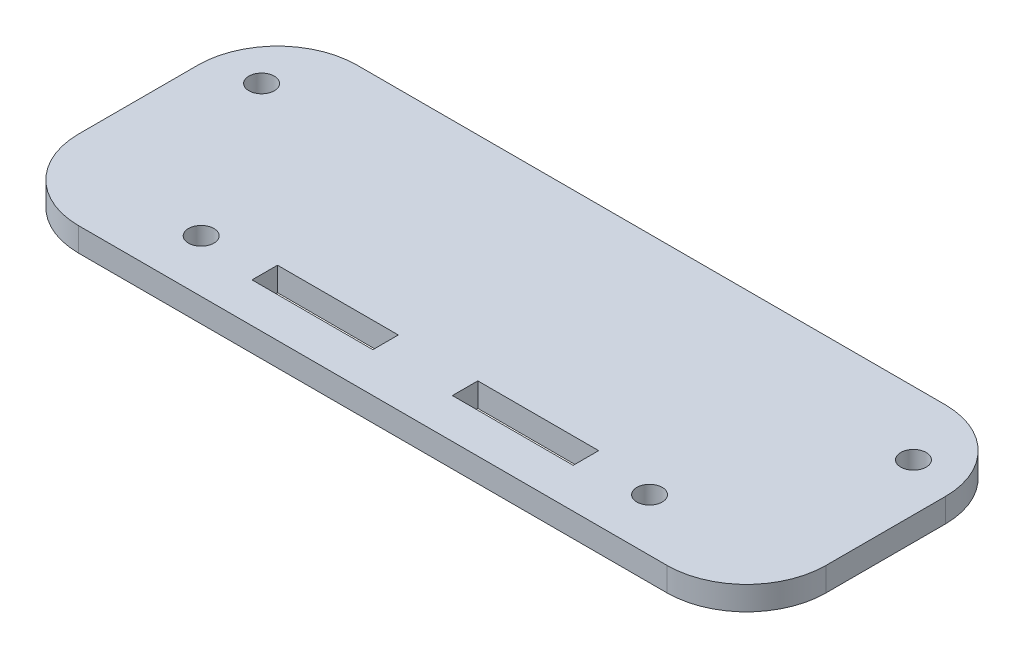
ISO-10303-21;
HEADER;
FILE_DESCRIPTION(('STEP AP214'),'2;1');
FILE_NAME('part.step','',(''),(''),'','','');
FILE_SCHEMA(('AUTOMOTIVE_DESIGN { 1 0 10303 214 1 1 1 1 }'));
ENDSEC;
DATA;
#1=APPLICATION_CONTEXT('core data for automotive mechanical design processes');
#2=APPLICATION_PROTOCOL_DEFINITION('international standard','automotive_design',2000,#1);
#3=PRODUCT_CONTEXT('',#1,'mechanical');
#4=PRODUCT('Part','Part','',(#3));
#5=PRODUCT_RELATED_PRODUCT_CATEGORY('part','',(#4));
#6=PRODUCT_DEFINITION_FORMATION('','',#4);
#7=PRODUCT_DEFINITION_CONTEXT('part definition',#1,'design');
#8=PRODUCT_DEFINITION('design','',#6,#7);
#9=PRODUCT_DEFINITION_SHAPE('','',#8);
#10=(LENGTH_UNIT() NAMED_UNIT(*) SI_UNIT(.MILLI.,.METRE.));
#11=(NAMED_UNIT(*) PLANE_ANGLE_UNIT() SI_UNIT($,.RADIAN.));
#12=(NAMED_UNIT(*) SI_UNIT($,.STERADIAN.) SOLID_ANGLE_UNIT());
#13=UNCERTAINTY_MEASURE_WITH_UNIT(LENGTH_MEASURE(1.E-05),#10,'distance_accuracy_value','');
#14=(GEOMETRIC_REPRESENTATION_CONTEXT(3) GLOBAL_UNCERTAINTY_ASSIGNED_CONTEXT((#13)) GLOBAL_UNIT_ASSIGNED_CONTEXT((#10,
#11,#12)) REPRESENTATION_CONTEXT('',''));
#15=CARTESIAN_POINT('',(0.,0.,0.));
#16=DIRECTION('',(0.,0.,1.));
#17=DIRECTION('',(1.,0.,0.));
#18=AXIS2_PLACEMENT_3D('',#15,#16,#17);
#19=CARTESIAN_POINT('',(0.,3.,0.));
#20=DIRECTION('',(0.,-1.,0.));
#21=DIRECTION('',(0.,0.,-1.));
#22=AXIS2_PLACEMENT_3D('',#19,#20,#21);
#23=PLANE('',#22);
#24=DIRECTION('',(0.,0.,1.));
#25=VECTOR('',#24,1.);
#26=CARTESIAN_POINT('',(14.8,3.,-8.2));
#27=LINE('',#26,#25);
#28=CARTESIAN_POINT('',(14.8,3.,-8.2));
#29=VERTEX_POINT('',#28);
#30=CARTESIAN_POINT('',(14.8,3.,-5.));
#31=VERTEX_POINT('',#30);
#32=EDGE_CURVE('E199',#29,#31,#27,.T.);
#33=ORIENTED_EDGE('',*,*,#32,.F.);
#34=DIRECTION('',(-1.,0.,0.));
#35=VECTOR('',#34,1.);
#36=CARTESIAN_POINT('',(14.8,3.,-8.2));
#37=LINE('',#36,#35);
#38=CARTESIAN_POINT('',(30.,3.,-8.2));
#39=VERTEX_POINT('',#38);
#40=EDGE_CURVE('E207',#39,#29,#37,.T.);
#41=ORIENTED_EDGE('',*,*,#40,.F.);
#42=DIRECTION('',(0.,0.,-1.));
#43=VECTOR('',#42,1.);
#44=CARTESIAN_POINT('',(30.,3.,-8.2));
#45=LINE('',#44,#43);
#46=CARTESIAN_POINT('',(30.,3.,-5.));
#47=VERTEX_POINT('',#46);
#48=EDGE_CURVE('E204',#47,#39,#45,.T.);
#49=ORIENTED_EDGE('',*,*,#48,.F.);
#50=DIRECTION('',(1.,0.,0.));
#51=VECTOR('',#50,1.);
#52=CARTESIAN_POINT('',(14.8,3.,-5.));
#53=LINE('',#52,#51);
#54=EDGE_CURVE('E201',#31,#47,#53,.T.);
#55=ORIENTED_EDGE('',*,*,#54,.F.);
#56=EDGE_LOOP('',(#33,#41,#49,#55));
#57=FACE_BOUND('',#56,.T.);
#58=DIRECTION('',(0.,0.,1.));
#59=VECTOR('',#58,1.);
#60=CARTESIAN_POINT('',(-12.,3.,-34.9999999999994));
#61=LINE('',#60,#59);
#62=CARTESIAN_POINT('',(-12.,3.,-24.9999999999994));
#63=VERTEX_POINT('',#62);
#64=CARTESIAN_POINT('',(-12.,3.,-10.));
#65=VERTEX_POINT('',#64);
#66=EDGE_CURVE('E284',#63,#65,#61,.T.);
#67=ORIENTED_EDGE('',*,*,#66,.T.);
#68=CARTESIAN_POINT('',(-1.99999999999999,3.,-10.));
#69=DIRECTION('',(0.,-1.,0.));
#70=DIRECTION('',(0.,0.,-1.));
#71=AXIS2_PLACEMENT_3D('',#68,#69,#70);
#72=CIRCLE('',#71,10.);
#73=CARTESIAN_POINT('',(-1.99999999999999,3.,0.));
#74=VERTEX_POINT('',#73);
#75=EDGE_CURVE('E246',#65,#74,#72,.F.);
#76=ORIENTED_EDGE('',*,*,#75,.T.);
#77=DIRECTION('',(1.,0.,0.));
#78=VECTOR('',#77,1.);
#79=CARTESIAN_POINT('',(0.,3.,0.));
#80=LINE('',#79,#78);
#81=CARTESIAN_POINT('',(72.,3.,0.));
#82=VERTEX_POINT('',#81);
#83=EDGE_CURVE('E230',#74,#82,#80,.T.);
#84=ORIENTED_EDGE('',*,*,#83,.T.);
#85=CARTESIAN_POINT('',(72.,3.,-10.));
#86=DIRECTION('',(0.,-1.,0.));
#87=DIRECTION('',(0.,0.,-1.));
#88=AXIS2_PLACEMENT_3D('',#85,#86,#87);
#89=CIRCLE('',#88,10.);
#90=CARTESIAN_POINT('',(82.,3.,-10.));
#91=VERTEX_POINT('',#90);
#92=EDGE_CURVE('E242',#82,#91,#89,.F.);
#93=ORIENTED_EDGE('',*,*,#92,.T.);
#94=DIRECTION('',(0.,0.,-1.));
#95=VECTOR('',#94,1.);
#96=CARTESIAN_POINT('',(82.,3.,-34.9999999999994));
#97=LINE('',#96,#95);
#98=CARTESIAN_POINT('',(82.,3.,-24.9999999999994));
#99=VERTEX_POINT('',#98);
#100=EDGE_CURVE('E268',#91,#99,#97,.T.);
#101=ORIENTED_EDGE('',*,*,#100,.T.);
#102=CARTESIAN_POINT('',(72.,3.,-24.9999999999994));
#103=DIRECTION('',(0.,-1.,0.));
#104=DIRECTION('',(0.,0.,-1.));
#105=AXIS2_PLACEMENT_3D('',#102,#103,#104);
#106=CIRCLE('',#105,10.);
#107=CARTESIAN_POINT('',(72.,3.,-34.9999999999994));
#108=VERTEX_POINT('',#107);
#109=EDGE_CURVE('E240',#99,#108,#106,.F.);
#110=ORIENTED_EDGE('',*,*,#109,.T.);
#111=DIRECTION('',(1.,0.,0.));
#112=VECTOR('',#111,1.);
#113=CARTESIAN_POINT('',(0.,3.,-34.9999999999994));
#114=LINE('',#113,#112);
#115=CARTESIAN_POINT('',(-2.,3.,-34.9999999999994));
#116=VERTEX_POINT('',#115);
#117=EDGE_CURVE('E279',#116,#108,#114,.T.);
#118=ORIENTED_EDGE('',*,*,#117,.F.);
#119=CARTESIAN_POINT('',(-2.,3.,-24.9999999999994));
#120=DIRECTION('',(0.,-1.,0.));
#121=DIRECTION('',(0.,0.,-1.));
#122=AXIS2_PLACEMENT_3D('',#119,#120,#121);
#123=CIRCLE('',#122,10.);
#124=EDGE_CURVE('E244',#116,#63,#123,.F.);
#125=ORIENTED_EDGE('',*,*,#124,.T.);
#126=EDGE_LOOP('',(#67,#76,#84,#93,#101,#110,#118,#125));
#127=FACE_BOUND('',#126,.T.);
#128=DIRECTION('',(0.,0.,1.));
#129=VECTOR('',#128,1.);
#130=CARTESIAN_POINT('',(40.,3.,-8.2));
#131=LINE('',#130,#129);
#132=CARTESIAN_POINT('',(40.,3.,-8.2));
#133=VERTEX_POINT('',#132);
#134=CARTESIAN_POINT('',(40.,3.,-5.));
#135=VERTEX_POINT('',#134);
#136=EDGE_CURVE('E155',#133,#135,#131,.T.);
#137=ORIENTED_EDGE('',*,*,#136,.F.);
#138=DIRECTION('',(-1.,0.,0.));
#139=VECTOR('',#138,1.);
#140=CARTESIAN_POINT('',(40.,3.,-8.2));
#141=LINE('',#140,#139);
#142=CARTESIAN_POINT('',(55.2,3.,-8.2));
#143=VERTEX_POINT('',#142);
#144=EDGE_CURVE('E181',#143,#133,#141,.T.);
#145=ORIENTED_EDGE('',*,*,#144,.F.);
#146=DIRECTION('',(0.,0.,-1.));
#147=VECTOR('',#146,1.);
#148=CARTESIAN_POINT('',(55.2,3.,-8.2));
#149=LINE('',#148,#147);
#150=CARTESIAN_POINT('',(55.2,3.,-5.));
#151=VERTEX_POINT('',#150);
#152=EDGE_CURVE('E179',#151,#143,#149,.T.);
#153=ORIENTED_EDGE('',*,*,#152,.F.);
#154=DIRECTION('',(1.,0.,0.));
#155=VECTOR('',#154,1.);
#156=CARTESIAN_POINT('',(40.,3.,-5.));
#157=LINE('',#156,#155);
#158=EDGE_CURVE('E165',#135,#151,#157,.T.);
#159=ORIENTED_EDGE('',*,*,#158,.F.);
#160=EDGE_LOOP('',(#137,#145,#153,#159));
#161=FACE_BOUND('',#160,.T.);
#162=CARTESIAN_POINT('',(6.80000000000004,3.,-6.6));
#163=DIRECTION('',(0.,1.,0.));
#164=DIRECTION('',(0.,0.,1.));
#165=AXIS2_PLACEMENT_3D('',#162,#163,#164);
#166=CIRCLE('',#165,1.6);
#167=CARTESIAN_POINT('',(6.80000000000004,3.,-5.));
#168=VERTEX_POINT('',#167);
#169=EDGE_CURVE('E188',#168,#168,#166,.T.);
#170=ORIENTED_EDGE('',*,*,#169,.F.);
#171=EDGE_LOOP('',(#170));
#172=FACE_BOUND('',#171,.T.);
#173=CARTESIAN_POINT('',(63.2,3.,-6.6));
#174=DIRECTION('',(0.,1.,0.));
#175=DIRECTION('',(0.,0.,1.));
#176=AXIS2_PLACEMENT_3D('',#173,#174,#175);
#177=CIRCLE('',#176,1.60000000000001);
#178=CARTESIAN_POINT('',(63.2,3.,-4.99999999999999));
#179=VERTEX_POINT('',#178);
#180=EDGE_CURVE('E293',#179,#179,#177,.T.);
#181=ORIENTED_EDGE('',*,*,#180,.F.);
#182=EDGE_LOOP('',(#181));
#183=FACE_BOUND('',#182,.T.);
#184=CARTESIAN_POINT('',(76.,3.,-26.9999999999994));
#185=DIRECTION('',(0.,1.,0.));
#186=DIRECTION('',(0.,0.,1.));
#187=AXIS2_PLACEMENT_3D('',#184,#185,#186);
#188=CIRCLE('',#187,1.6);
#189=CARTESIAN_POINT('',(76.,3.,-25.3999999999994));
#190=VERTEX_POINT('',#189);
#191=EDGE_CURVE('E276',#190,#190,#188,.T.);
#192=ORIENTED_EDGE('',*,*,#191,.F.);
#193=EDGE_LOOP('',(#192));
#194=FACE_BOUND('',#193,.T.);
#195=CARTESIAN_POINT('',(-5.99999999999999,3.,-26.9999999999994));
#196=DIRECTION('',(0.,1.,0.));
#197=DIRECTION('',(0.,0.,1.));
#198=AXIS2_PLACEMENT_3D('',#195,#196,#197);
#199=CIRCLE('',#198,1.6);
#200=CARTESIAN_POINT('',(-5.99999999999999,3.,-25.3999999999994));
#201=VERTEX_POINT('',#200);
#202=EDGE_CURVE('E366',#201,#201,#199,.T.);
#203=ORIENTED_EDGE('',*,*,#202,.F.);
#204=EDGE_LOOP('',(#203));
#205=FACE_BOUND('',#204,.T.);
#206=ADVANCED_FACE('F41',(#57,#127,#161,#172,#183,#194,#205),#23,.F.);
#207=CARTESIAN_POINT('',(0.,0.,0.));
#208=DIRECTION('',(0.,-1.,0.));
#209=DIRECTION('',(0.,0.,-1.));
#210=AXIS2_PLACEMENT_3D('',#207,#208,#209);
#211=PLANE('',#210);
#212=DIRECTION('',(1.,0.,0.));
#213=VECTOR('',#212,1.);
#214=CARTESIAN_POINT('',(0.,0.,0.));
#215=LINE('',#214,#213);
#216=CARTESIAN_POINT('',(-1.99999999999999,0.,0.));
#217=VERTEX_POINT('',#216);
#218=CARTESIAN_POINT('',(72.,0.,0.));
#219=VERTEX_POINT('',#218);
#220=EDGE_CURVE('E229',#217,#219,#215,.T.);
#221=ORIENTED_EDGE('',*,*,#220,.F.);
#222=CARTESIAN_POINT('',(-1.99999999999999,0.,-10.));
#223=DIRECTION('',(0.,-1.,0.));
#224=DIRECTION('',(0.,0.,-1.));
#225=AXIS2_PLACEMENT_3D('',#222,#223,#224);
#226=CIRCLE('',#225,10.);
#227=CARTESIAN_POINT('',(-12.,0.,-10.));
#228=VERTEX_POINT('',#227);
#229=EDGE_CURVE('E258',#217,#228,#226,.T.);
#230=ORIENTED_EDGE('',*,*,#229,.T.);
#231=DIRECTION('',(0.,0.,1.));
#232=VECTOR('',#231,1.);
#233=CARTESIAN_POINT('',(-12.,0.,-34.9999999999994));
#234=LINE('',#233,#232);
#235=CARTESIAN_POINT('',(-12.,0.,-24.9999999999994));
#236=VERTEX_POINT('',#235);
#237=EDGE_CURVE('E288',#236,#228,#234,.T.);
#238=ORIENTED_EDGE('',*,*,#237,.F.);
#239=CARTESIAN_POINT('',(-2.,0.,-24.9999999999994));
#240=DIRECTION('',(0.,-1.,0.));
#241=DIRECTION('',(0.,0.,-1.));
#242=AXIS2_PLACEMENT_3D('',#239,#240,#241);
#243=CIRCLE('',#242,10.);
#244=CARTESIAN_POINT('',(-2.,0.,-34.9999999999994));
#245=VERTEX_POINT('',#244);
#246=EDGE_CURVE('E256',#236,#245,#243,.T.);
#247=ORIENTED_EDGE('',*,*,#246,.T.);
#248=DIRECTION('',(1.,0.,0.));
#249=VECTOR('',#248,1.);
#250=CARTESIAN_POINT('',(0.,0.,-34.9999999999994));
#251=LINE('',#250,#249);
#252=CARTESIAN_POINT('',(72.,0.,-34.9999999999994));
#253=VERTEX_POINT('',#252);
#254=EDGE_CURVE('E289',#245,#253,#251,.T.);
#255=ORIENTED_EDGE('',*,*,#254,.T.);
#256=CARTESIAN_POINT('',(72.,0.,-24.9999999999994));
#257=DIRECTION('',(0.,-1.,0.));
#258=DIRECTION('',(0.,0.,-1.));
#259=AXIS2_PLACEMENT_3D('',#256,#257,#258);
#260=CIRCLE('',#259,10.);
#261=CARTESIAN_POINT('',(82.,0.,-24.9999999999994));
#262=VERTEX_POINT('',#261);
#263=EDGE_CURVE('E56',#253,#262,#260,.T.);
#264=ORIENTED_EDGE('',*,*,#263,.T.);
#265=DIRECTION('',(0.,0.,-1.));
#266=VECTOR('',#265,1.);
#267=CARTESIAN_POINT('',(82.,0.,-34.9999999999994));
#268=LINE('',#267,#266);
#269=CARTESIAN_POINT('',(82.,0.,-10.));
#270=VERTEX_POINT('',#269);
#271=EDGE_CURVE('E269',#270,#262,#268,.T.);
#272=ORIENTED_EDGE('',*,*,#271,.F.);
#273=CARTESIAN_POINT('',(72.,0.,-10.));
#274=DIRECTION('',(0.,-1.,0.));
#275=DIRECTION('',(0.,0.,-1.));
#276=AXIS2_PLACEMENT_3D('',#273,#274,#275);
#277=CIRCLE('',#276,10.);
#278=EDGE_CURVE('E254',#270,#219,#277,.T.);
#279=ORIENTED_EDGE('',*,*,#278,.T.);
#280=EDGE_LOOP('',(#221,#230,#238,#247,#255,#264,#272,#279));
#281=FACE_BOUND('',#280,.T.);
#282=CARTESIAN_POINT('',(6.80000000000004,0.,-6.6));
#283=DIRECTION('',(0.,1.,0.));
#284=DIRECTION('',(0.,0.,1.));
#285=AXIS2_PLACEMENT_3D('',#282,#283,#284);
#286=CIRCLE('',#285,1.6);
#287=CARTESIAN_POINT('',(6.80000000000004,0.,-5.));
#288=VERTEX_POINT('',#287);
#289=EDGE_CURVE('E296',#288,#288,#286,.T.);
#290=ORIENTED_EDGE('',*,*,#289,.T.);
#291=EDGE_LOOP('',(#290));
#292=FACE_BOUND('',#291,.T.);
#293=DIRECTION('',(-1.,0.,0.));
#294=VECTOR('',#293,1.);
#295=CARTESIAN_POINT('',(14.8,0.,-8.2));
#296=LINE('',#295,#294);
#297=CARTESIAN_POINT('',(30.,0.,-8.2));
#298=VERTEX_POINT('',#297);
#299=CARTESIAN_POINT('',(14.8,0.,-8.2));
#300=VERTEX_POINT('',#299);
#301=EDGE_CURVE('E202',#298,#300,#296,.T.);
#302=ORIENTED_EDGE('',*,*,#301,.T.);
#303=DIRECTION('',(0.,0.,1.));
#304=VECTOR('',#303,1.);
#305=CARTESIAN_POINT('',(14.8,0.,-8.2));
#306=LINE('',#305,#304);
#307=CARTESIAN_POINT('',(14.8,0.,-5.));
#308=VERTEX_POINT('',#307);
#309=EDGE_CURVE('E173',#300,#308,#306,.T.);
#310=ORIENTED_EDGE('',*,*,#309,.T.);
#311=DIRECTION('',(1.,0.,0.));
#312=VECTOR('',#311,1.);
#313=CARTESIAN_POINT('',(14.8,0.,-5.));
#314=LINE('',#313,#312);
#315=CARTESIAN_POINT('',(30.,0.,-5.));
#316=VERTEX_POINT('',#315);
#317=EDGE_CURVE('E212',#308,#316,#314,.T.);
#318=ORIENTED_EDGE('',*,*,#317,.T.);
#319=DIRECTION('',(0.,0.,-1.));
#320=VECTOR('',#319,1.);
#321=CARTESIAN_POINT('',(30.,0.,-8.2));
#322=LINE('',#321,#320);
#323=EDGE_CURVE('E215',#316,#298,#322,.T.);
#324=ORIENTED_EDGE('',*,*,#323,.T.);
#325=EDGE_LOOP('',(#302,#310,#318,#324));
#326=FACE_BOUND('',#325,.T.);
#327=DIRECTION('',(-1.,0.,0.));
#328=VECTOR('',#327,1.);
#329=CARTESIAN_POINT('',(40.,0.,-8.2));
#330=LINE('',#329,#328);
#331=CARTESIAN_POINT('',(55.2,0.,-8.2));
#332=VERTEX_POINT('',#331);
#333=CARTESIAN_POINT('',(40.,0.,-8.2));
#334=VERTEX_POINT('',#333);
#335=EDGE_CURVE('E166',#332,#334,#330,.T.);
#336=ORIENTED_EDGE('',*,*,#335,.T.);
#337=DIRECTION('',(0.,0.,1.));
#338=VECTOR('',#337,1.);
#339=CARTESIAN_POINT('',(40.,0.,-8.2));
#340=LINE('',#339,#338);
#341=CARTESIAN_POINT('',(40.,0.,-5.));
#342=VERTEX_POINT('',#341);
#343=EDGE_CURVE('E186',#334,#342,#340,.T.);
#344=ORIENTED_EDGE('',*,*,#343,.T.);
#345=DIRECTION('',(1.,0.,0.));
#346=VECTOR('',#345,1.);
#347=CARTESIAN_POINT('',(40.,0.,-5.));
#348=LINE('',#347,#346);
#349=CARTESIAN_POINT('',(55.2,0.,-5.));
#350=VERTEX_POINT('',#349);
#351=EDGE_CURVE('E172',#342,#350,#348,.T.);
#352=ORIENTED_EDGE('',*,*,#351,.T.);
#353=DIRECTION('',(0.,0.,-1.));
#354=VECTOR('',#353,1.);
#355=CARTESIAN_POINT('',(55.2,0.,-8.2));
#356=LINE('',#355,#354);
#357=EDGE_CURVE('E190',#350,#332,#356,.T.);
#358=ORIENTED_EDGE('',*,*,#357,.T.);
#359=EDGE_LOOP('',(#336,#344,#352,#358));
#360=FACE_BOUND('',#359,.T.);
#361=CARTESIAN_POINT('',(63.2,0.,-6.6));
#362=DIRECTION('',(0.,1.,0.));
#363=DIRECTION('',(0.,0.,1.));
#364=AXIS2_PLACEMENT_3D('',#361,#362,#363);
#365=CIRCLE('',#364,1.60000000000001);
#366=CARTESIAN_POINT('',(63.2,0.,-4.99999999999999));
#367=VERTEX_POINT('',#366);
#368=EDGE_CURVE('E291',#367,#367,#365,.T.);
#369=ORIENTED_EDGE('',*,*,#368,.T.);
#370=EDGE_LOOP('',(#369));
#371=FACE_BOUND('',#370,.T.);
#372=CARTESIAN_POINT('',(76.,0.,-26.9999999999994));
#373=DIRECTION('',(0.,-1.,0.));
#374=DIRECTION('',(0.,0.,-1.));
#375=AXIS2_PLACEMENT_3D('',#372,#373,#374);
#376=CIRCLE('',#375,1.6);
#377=CARTESIAN_POINT('',(76.,0.,-28.5999999999994));
#378=VERTEX_POINT('',#377);
#379=EDGE_CURVE('E275',#378,#378,#376,.F.);
#380=ORIENTED_EDGE('',*,*,#379,.T.);
#381=EDGE_LOOP('',(#380));
#382=FACE_BOUND('',#381,.T.);
#383=CARTESIAN_POINT('',(-5.99999999999999,0.,-26.9999999999994));
#384=DIRECTION('',(0.,-1.,0.));
#385=DIRECTION('',(0.,0.,-1.));
#386=AXIS2_PLACEMENT_3D('',#383,#384,#385);
#387=CIRCLE('',#386,1.6);
#388=CARTESIAN_POINT('',(-5.99999999999999,0.,-28.5999999999994));
#389=VERTEX_POINT('',#388);
#390=EDGE_CURVE('E370',#389,#389,#387,.F.);
#391=ORIENTED_EDGE('',*,*,#390,.T.);
#392=EDGE_LOOP('',(#391));
#393=FACE_BOUND('',#392,.T.);
#394=ADVANCED_FACE('F303',(#281,#292,#326,#360,#371,#382,#393),#211,.T.);
#395=CARTESIAN_POINT('',(0.,3.,0.));
#396=DIRECTION('',(0.,0.,-1.));
#397=DIRECTION('',(-1.,0.,0.));
#398=AXIS2_PLACEMENT_3D('',#395,#396,#397);
#399=PLANE('',#398);
#400=ORIENTED_EDGE('',*,*,#83,.F.);
#401=DIRECTION('',(0.,1.,0.));
#402=VECTOR('',#401,1.);
#403=CARTESIAN_POINT('',(-1.99999999999999,0.,0.));
#404=LINE('',#403,#402);
#405=EDGE_CURVE('E251',#74,#217,#404,.F.);
#406=ORIENTED_EDGE('',*,*,#405,.T.);
#407=ORIENTED_EDGE('',*,*,#220,.T.);
#408=DIRECTION('',(0.,1.,0.));
#409=VECTOR('',#408,1.);
#410=CARTESIAN_POINT('',(72.,3.,0.));
#411=LINE('',#410,#409);
#412=EDGE_CURVE('E248',#219,#82,#411,.T.);
#413=ORIENTED_EDGE('',*,*,#412,.T.);
#414=EDGE_LOOP('',(#400,#406,#407,#413));
#415=FACE_BOUND('',#414,.T.);
#416=ADVANCED_FACE('F328',(#415),#399,.F.);
#417=CARTESIAN_POINT('',(14.8,3.,-8.2));
#418=DIRECTION('',(1.,0.,0.));
#419=DIRECTION('',(0.,0.,-1.));
#420=AXIS2_PLACEMENT_3D('',#417,#418,#419);
#421=PLANE('',#420);
#422=ORIENTED_EDGE('',*,*,#309,.F.);
#423=DIRECTION('',(0.,-1.,0.));
#424=VECTOR('',#423,1.);
#425=CARTESIAN_POINT('',(14.8,3.,-8.2));
#426=LINE('',#425,#424);
#427=EDGE_CURVE('E209',#29,#300,#426,.T.);
#428=ORIENTED_EDGE('',*,*,#427,.F.);
#429=ORIENTED_EDGE('',*,*,#32,.T.);
#430=DIRECTION('',(0.,-1.,0.));
#431=VECTOR('',#430,1.);
#432=CARTESIAN_POINT('',(14.8,3.,-5.));
#433=LINE('',#432,#431);
#434=EDGE_CURVE('E226',#31,#308,#433,.T.);
#435=ORIENTED_EDGE('',*,*,#434,.T.);
#436=EDGE_LOOP('',(#422,#428,#429,#435));
#437=FACE_BOUND('',#436,.T.);
#438=ADVANCED_FACE('F332',(#437),#421,.T.);
#439=CARTESIAN_POINT('',(14.8,3.,-5.));
#440=DIRECTION('',(0.,0.,-1.));
#441=DIRECTION('',(-1.,0.,0.));
#442=AXIS2_PLACEMENT_3D('',#439,#440,#441);
#443=PLANE('',#442);
#444=ORIENTED_EDGE('',*,*,#317,.F.);
#445=ORIENTED_EDGE('',*,*,#434,.F.);
#446=ORIENTED_EDGE('',*,*,#54,.T.);
#447=DIRECTION('',(0.,-1.,0.));
#448=VECTOR('',#447,1.);
#449=CARTESIAN_POINT('',(30.,3.,-5.));
#450=LINE('',#449,#448);
#451=EDGE_CURVE('E224',#47,#316,#450,.T.);
#452=ORIENTED_EDGE('',*,*,#451,.T.);
#453=EDGE_LOOP('',(#444,#445,#446,#452));
#454=FACE_BOUND('',#453,.T.);
#455=ADVANCED_FACE('F519',(#454),#443,.T.);
#456=CARTESIAN_POINT('',(30.,3.,-8.2));
#457=DIRECTION('',(-1.,0.,0.));
#458=DIRECTION('',(0.,0.,1.));
#459=AXIS2_PLACEMENT_3D('',#456,#457,#458);
#460=PLANE('',#459);
#461=ORIENTED_EDGE('',*,*,#323,.F.);
#462=ORIENTED_EDGE('',*,*,#451,.F.);
#463=ORIENTED_EDGE('',*,*,#48,.T.);
#464=DIRECTION('',(0.,-1.,0.));
#465=VECTOR('',#464,1.);
#466=CARTESIAN_POINT('',(30.,3.,-8.2));
#467=LINE('',#466,#465);
#468=EDGE_CURVE('E222',#39,#298,#467,.T.);
#469=ORIENTED_EDGE('',*,*,#468,.T.);
#470=EDGE_LOOP('',(#461,#462,#463,#469));
#471=FACE_BOUND('',#470,.T.);
#472=ADVANCED_FACE('F509',(#471),#460,.T.);
#473=CARTESIAN_POINT('',(14.8,3.,-8.2));
#474=DIRECTION('',(0.,0.,1.));
#475=DIRECTION('',(1.,0.,0.));
#476=AXIS2_PLACEMENT_3D('',#473,#474,#475);
#477=PLANE('',#476);
#478=ORIENTED_EDGE('',*,*,#301,.F.);
#479=ORIENTED_EDGE('',*,*,#468,.F.);
#480=ORIENTED_EDGE('',*,*,#40,.T.);
#481=ORIENTED_EDGE('',*,*,#427,.T.);
#482=EDGE_LOOP('',(#478,#479,#480,#481));
#483=FACE_BOUND('',#482,.T.);
#484=ADVANCED_FACE('F500',(#483),#477,.T.);
#485=CARTESIAN_POINT('',(40.,3.,-8.2));
#486=DIRECTION('',(1.,0.,0.));
#487=DIRECTION('',(0.,0.,-1.));
#488=AXIS2_PLACEMENT_3D('',#485,#486,#487);
#489=PLANE('',#488);
#490=ORIENTED_EDGE('',*,*,#343,.F.);
#491=DIRECTION('',(0.,-1.,0.));
#492=VECTOR('',#491,1.);
#493=CARTESIAN_POINT('',(40.,3.,-8.2));
#494=LINE('',#493,#492);
#495=EDGE_CURVE('E161',#133,#334,#494,.T.);
#496=ORIENTED_EDGE('',*,*,#495,.F.);
#497=ORIENTED_EDGE('',*,*,#136,.T.);
#498=DIRECTION('',(0.,-1.,0.));
#499=VECTOR('',#498,1.);
#500=CARTESIAN_POINT('',(40.,3.,-5.));
#501=LINE('',#500,#499);
#502=EDGE_CURVE('E158',#135,#342,#501,.T.);
#503=ORIENTED_EDGE('',*,*,#502,.T.);
#504=EDGE_LOOP('',(#490,#496,#497,#503));
#505=FACE_BOUND('',#504,.T.);
#506=ADVANCED_FACE('F157',(#505),#489,.T.);
#507=CARTESIAN_POINT('',(40.,3.,-5.));
#508=DIRECTION('',(0.,0.,-1.));
#509=DIRECTION('',(-1.,0.,0.));
#510=AXIS2_PLACEMENT_3D('',#507,#508,#509);
#511=PLANE('',#510);
#512=ORIENTED_EDGE('',*,*,#351,.F.);
#513=ORIENTED_EDGE('',*,*,#502,.F.);
#514=ORIENTED_EDGE('',*,*,#158,.T.);
#515=DIRECTION('',(0.,-1.,0.));
#516=VECTOR('',#515,1.);
#517=CARTESIAN_POINT('',(55.2,3.,-5.));
#518=LINE('',#517,#516);
#519=EDGE_CURVE('E174',#151,#350,#518,.T.);
#520=ORIENTED_EDGE('',*,*,#519,.T.);
#521=EDGE_LOOP('',(#512,#513,#514,#520));
#522=FACE_BOUND('',#521,.T.);
#523=ADVANCED_FACE('F169',(#522),#511,.T.);
#524=CARTESIAN_POINT('',(55.2,3.,-8.2));
#525=DIRECTION('',(-1.,0.,0.));
#526=DIRECTION('',(0.,0.,1.));
#527=AXIS2_PLACEMENT_3D('',#524,#525,#526);
#528=PLANE('',#527);
#529=ORIENTED_EDGE('',*,*,#357,.F.);
#530=ORIENTED_EDGE('',*,*,#519,.F.);
#531=ORIENTED_EDGE('',*,*,#152,.T.);
#532=DIRECTION('',(0.,-1.,0.));
#533=VECTOR('',#532,1.);
#534=CARTESIAN_POINT('',(55.2,3.,-8.2));
#535=LINE('',#534,#533);
#536=EDGE_CURVE('E196',#143,#332,#535,.T.);
#537=ORIENTED_EDGE('',*,*,#536,.T.);
#538=EDGE_LOOP('',(#529,#530,#531,#537));
#539=FACE_BOUND('',#538,.T.);
#540=ADVANCED_FACE('F319',(#539),#528,.T.);
#541=CARTESIAN_POINT('',(40.,3.,-8.2));
#542=DIRECTION('',(0.,0.,1.));
#543=DIRECTION('',(1.,0.,0.));
#544=AXIS2_PLACEMENT_3D('',#541,#542,#543);
#545=PLANE('',#544);
#546=ORIENTED_EDGE('',*,*,#335,.F.);
#547=ORIENTED_EDGE('',*,*,#536,.F.);
#548=ORIENTED_EDGE('',*,*,#144,.T.);
#549=ORIENTED_EDGE('',*,*,#495,.T.);
#550=EDGE_LOOP('',(#546,#547,#548,#549));
#551=FACE_BOUND('',#550,.T.);
#552=ADVANCED_FACE('F309',(#551),#545,.T.);
#553=CARTESIAN_POINT('',(6.80000000000004,3.,-6.6));
#554=DIRECTION('',(0.,-1.,0.));
#555=DIRECTION('',(0.,0.,-1.));
#556=AXIS2_PLACEMENT_3D('',#553,#554,#555);
#557=CYLINDRICAL_SURFACE('',#556,1.6);
#558=ORIENTED_EDGE('',*,*,#169,.T.);
#559=EDGE_LOOP('',(#558));
#560=FACE_BOUND('',#559,.T.);
#561=ORIENTED_EDGE('',*,*,#289,.F.);
#562=EDGE_LOOP('',(#561));
#563=FACE_BOUND('',#562,.T.);
#564=ADVANCED_FACE('F306',(#560,#563),#557,.F.);
#565=CARTESIAN_POINT('',(63.2,3.,-6.6));
#566=DIRECTION('',(0.,-1.,0.));
#567=DIRECTION('',(0.,0.,-1.));
#568=AXIS2_PLACEMENT_3D('',#565,#566,#567);
#569=CYLINDRICAL_SURFACE('',#568,1.60000000000001);
#570=ORIENTED_EDGE('',*,*,#180,.T.);
#571=EDGE_LOOP('',(#570));
#572=FACE_BOUND('',#571,.T.);
#573=ORIENTED_EDGE('',*,*,#368,.F.);
#574=EDGE_LOOP('',(#573));
#575=FACE_BOUND('',#574,.T.);
#576=ADVANCED_FACE('F308',(#572,#575),#569,.F.);
#577=CARTESIAN_POINT('',(0.,0.,-34.9999999999994));
#578=DIRECTION('',(0.,0.,1.));
#579=DIRECTION('',(1.,0.,0.));
#580=AXIS2_PLACEMENT_3D('',#577,#578,#579);
#581=PLANE('',#580);
#582=ORIENTED_EDGE('',*,*,#254,.F.);
#583=DIRECTION('',(0.,1.,0.));
#584=VECTOR('',#583,1.);
#585=CARTESIAN_POINT('',(-2.,3.,-34.9999999999994));
#586=LINE('',#585,#584);
#587=EDGE_CURVE('E262',#245,#116,#586,.T.);
#588=ORIENTED_EDGE('',*,*,#587,.T.);
#589=ORIENTED_EDGE('',*,*,#117,.T.);
#590=DIRECTION('',(0.,1.,0.));
#591=VECTOR('',#590,1.);
#592=CARTESIAN_POINT('',(72.,0.,-34.9999999999994));
#593=LINE('',#592,#591);
#594=EDGE_CURVE('E260',#108,#253,#593,.F.);
#595=ORIENTED_EDGE('',*,*,#594,.T.);
#596=EDGE_LOOP('',(#582,#588,#589,#595));
#597=FACE_BOUND('',#596,.T.);
#598=ADVANCED_FACE('F316',(#597),#581,.F.);
#599=CARTESIAN_POINT('',(82.,-36.9999999999995,-34.9999999999994));
#600=DIRECTION('',(1.,0.,0.));
#601=DIRECTION('',(0.,0.,-1.));
#602=AXIS2_PLACEMENT_3D('',#599,#600,#601);
#603=PLANE('',#602);
#604=ORIENTED_EDGE('',*,*,#100,.F.);
#605=DIRECTION('',(0.,1.,0.));
#606=VECTOR('',#605,1.);
#607=CARTESIAN_POINT('',(82.,0.,-10.));
#608=LINE('',#607,#606);
#609=EDGE_CURVE('E11',#91,#270,#608,.F.);
#610=ORIENTED_EDGE('',*,*,#609,.T.);
#611=ORIENTED_EDGE('',*,*,#271,.T.);
#612=DIRECTION('',(0.,1.,0.));
#613=VECTOR('',#612,1.);
#614=CARTESIAN_POINT('',(82.,3.,-24.9999999999994));
#615=LINE('',#614,#613);
#616=EDGE_CURVE('E49',#262,#99,#615,.T.);
#617=ORIENTED_EDGE('',*,*,#616,.T.);
#618=EDGE_LOOP('',(#604,#610,#611,#617));
#619=FACE_BOUND('',#618,.T.);
#620=ADVANCED_FACE('F267',(#619),#603,.T.);
#621=CARTESIAN_POINT('',(76.,-36.9999999999995,-26.9999999999994));
#622=DIRECTION('',(0.,1.,0.));
#623=DIRECTION('',(0.,0.,1.));
#624=AXIS2_PLACEMENT_3D('',#621,#622,#623);
#625=CYLINDRICAL_SURFACE('',#624,1.6);
#626=ORIENTED_EDGE('',*,*,#191,.T.);
#627=EDGE_LOOP('',(#626));
#628=FACE_BOUND('',#627,.T.);
#629=ORIENTED_EDGE('',*,*,#379,.F.);
#630=EDGE_LOOP('',(#629));
#631=FACE_BOUND('',#630,.T.);
#632=ADVANCED_FACE('F383',(#628,#631),#625,.F.);
#633=CARTESIAN_POINT('',(-12.,-36.9999999999995,-34.9999999999994));
#634=DIRECTION('',(-1.,0.,0.));
#635=DIRECTION('',(0.,0.,1.));
#636=AXIS2_PLACEMENT_3D('',#633,#634,#635);
#637=PLANE('',#636);
#638=ORIENTED_EDGE('',*,*,#237,.T.);
#639=DIRECTION('',(0.,1.,0.));
#640=VECTOR('',#639,1.);
#641=CARTESIAN_POINT('',(-12.,3.,-10.));
#642=LINE('',#641,#640);
#643=EDGE_CURVE('E237',#228,#65,#642,.T.);
#644=ORIENTED_EDGE('',*,*,#643,.T.);
#645=ORIENTED_EDGE('',*,*,#66,.F.);
#646=DIRECTION('',(0.,1.,0.));
#647=VECTOR('',#646,1.);
#648=CARTESIAN_POINT('',(-12.,0.,-24.9999999999994));
#649=LINE('',#648,#647);
#650=EDGE_CURVE('E233',#63,#236,#649,.F.);
#651=ORIENTED_EDGE('',*,*,#650,.T.);
#652=EDGE_LOOP('',(#638,#644,#645,#651));
#653=FACE_BOUND('',#652,.T.);
#654=ADVANCED_FACE('F363',(#653),#637,.T.);
#655=CARTESIAN_POINT('',(-5.99999999999999,-36.9999999999995,-26.9999999999994));
#656=DIRECTION('',(0.,1.,0.));
#657=DIRECTION('',(0.,0.,1.));
#658=AXIS2_PLACEMENT_3D('',#655,#656,#657);
#659=CYLINDRICAL_SURFACE('',#658,1.6);
#660=ORIENTED_EDGE('',*,*,#202,.T.);
#661=EDGE_LOOP('',(#660));
#662=FACE_BOUND('',#661,.T.);
#663=ORIENTED_EDGE('',*,*,#390,.F.);
#664=EDGE_LOOP('',(#663));
#665=FACE_BOUND('',#664,.T.);
#666=ADVANCED_FACE('F342',(#662,#665),#659,.F.);
#667=CARTESIAN_POINT('',(-1.99999999999999,-36.9999999999995,-10.));
#668=DIRECTION('',(0.,-1.,0.));
#669=DIRECTION('',(0.,0.,-1.));
#670=AXIS2_PLACEMENT_3D('',#667,#668,#669);
#671=CYLINDRICAL_SURFACE('',#670,10.);
#672=ORIENTED_EDGE('',*,*,#229,.F.);
#673=ORIENTED_EDGE('',*,*,#405,.F.);
#674=ORIENTED_EDGE('',*,*,#75,.F.);
#675=ORIENTED_EDGE('',*,*,#643,.F.);
#676=EDGE_LOOP('',(#672,#673,#674,#675));
#677=FACE_BOUND('',#676,.T.);
#678=ADVANCED_FACE('F338',(#677),#671,.T.);
#679=CARTESIAN_POINT('',(-2.,0.,-24.9999999999994));
#680=DIRECTION('',(0.,-1.,0.));
#681=DIRECTION('',(0.,0.,-1.));
#682=AXIS2_PLACEMENT_3D('',#679,#680,#681);
#683=CYLINDRICAL_SURFACE('',#682,10.);
#684=ORIENTED_EDGE('',*,*,#246,.F.);
#685=ORIENTED_EDGE('',*,*,#650,.F.);
#686=ORIENTED_EDGE('',*,*,#124,.F.);
#687=ORIENTED_EDGE('',*,*,#587,.F.);
#688=EDGE_LOOP('',(#684,#685,#686,#687));
#689=FACE_BOUND('',#688,.T.);
#690=ADVANCED_FACE('F341',(#689),#683,.T.);
#691=CARTESIAN_POINT('',(72.,3.,-10.));
#692=DIRECTION('',(0.,-1.,0.));
#693=DIRECTION('',(0.,0.,-1.));
#694=AXIS2_PLACEMENT_3D('',#691,#692,#693);
#695=CYLINDRICAL_SURFACE('',#694,10.);
#696=ORIENTED_EDGE('',*,*,#278,.F.);
#697=ORIENTED_EDGE('',*,*,#609,.F.);
#698=ORIENTED_EDGE('',*,*,#92,.F.);
#699=ORIENTED_EDGE('',*,*,#412,.F.);
#700=EDGE_LOOP('',(#696,#697,#698,#699));
#701=FACE_BOUND('',#700,.T.);
#702=ADVANCED_FACE('F345',(#701),#695,.T.);
#703=CARTESIAN_POINT('',(72.,-36.9999999999995,-24.9999999999994));
#704=DIRECTION('',(0.,-1.,0.));
#705=DIRECTION('',(0.,0.,-1.));
#706=AXIS2_PLACEMENT_3D('',#703,#704,#705);
#707=CYLINDRICAL_SURFACE('',#706,10.);
#708=ORIENTED_EDGE('',*,*,#263,.F.);
#709=ORIENTED_EDGE('',*,*,#594,.F.);
#710=ORIENTED_EDGE('',*,*,#109,.F.);
#711=ORIENTED_EDGE('',*,*,#616,.F.);
#712=EDGE_LOOP('',(#708,#709,#710,#711));
#713=FACE_BOUND('',#712,.T.);
#714=ADVANCED_FACE('F43',(#713),#707,.T.);
#715=CLOSED_SHELL('',(#206,#394,#416,#438,#455,#472,#484,#506,#523,#540,#552,#564,#576,#598,
#620,#632,#654,#666,#678,#690,#702,#714));
#716=MANIFOLD_SOLID_BREP('B2',#715);
#717=ADVANCED_BREP_SHAPE_REPRESENTATION('',(#18,#716),#14);
#718=SHAPE_DEFINITION_REPRESENTATION(#9,#717);
ENDSEC;
END-ISO-10303-21;
